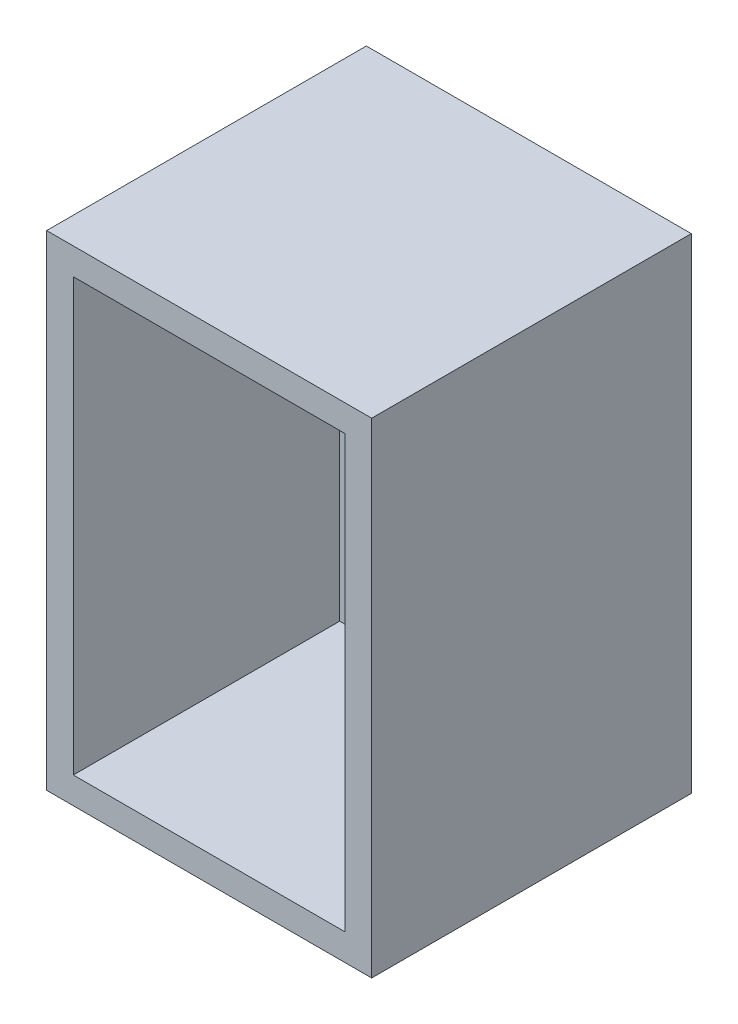
ISO-10303-21;
HEADER;
FILE_DESCRIPTION(('STEP AP214'),'2;1');
FILE_NAME('part.step','',(''),(''),'','','');
FILE_SCHEMA(('AUTOMOTIVE_DESIGN { 1 0 10303 214 1 1 1 1 }'));
ENDSEC;
DATA;
#1=APPLICATION_CONTEXT('core data for automotive mechanical design processes');
#2=APPLICATION_PROTOCOL_DEFINITION('international standard','automotive_design',2000,#1);
#3=PRODUCT_CONTEXT('',#1,'mechanical');
#4=PRODUCT('Part','Part','',(#3));
#5=PRODUCT_RELATED_PRODUCT_CATEGORY('part','',(#4));
#6=PRODUCT_DEFINITION_FORMATION('','',#4);
#7=PRODUCT_DEFINITION_CONTEXT('part definition',#1,'design');
#8=PRODUCT_DEFINITION('design','',#6,#7);
#9=PRODUCT_DEFINITION_SHAPE('','',#8);
#10=(LENGTH_UNIT() NAMED_UNIT(*) SI_UNIT(.MILLI.,.METRE.));
#11=(NAMED_UNIT(*) PLANE_ANGLE_UNIT() SI_UNIT($,.RADIAN.));
#12=(NAMED_UNIT(*) SI_UNIT($,.STERADIAN.) SOLID_ANGLE_UNIT());
#13=UNCERTAINTY_MEASURE_WITH_UNIT(LENGTH_MEASURE(1.E-05),#10,'distance_accuracy_value','');
#14=(GEOMETRIC_REPRESENTATION_CONTEXT(3) GLOBAL_UNCERTAINTY_ASSIGNED_CONTEXT((#13)) GLOBAL_UNIT_ASSIGNED_CONTEXT((#10,
#11,#12)) REPRESENTATION_CONTEXT('',''));
#15=CARTESIAN_POINT('',(0.,0.,0.));
#16=DIRECTION('',(0.,0.,1.));
#17=DIRECTION('',(1.,0.,0.));
#18=AXIS2_PLACEMENT_3D('',#15,#16,#17);
#19=CARTESIAN_POINT('',(0.,0.,50.));
#20=DIRECTION('',(0.,0.,1.));
#21=DIRECTION('',(1.,0.,0.));
#22=AXIS2_PLACEMENT_3D('',#19,#20,#21);
#23=PLANE('',#22);
#24=DIRECTION('',(0.,1.,0.));
#25=VECTOR('',#24,1.);
#26=CARTESIAN_POINT('',(30.5,-45.5,50.));
#27=LINE('',#26,#25);
#28=CARTESIAN_POINT('',(30.5,-45.5,50.));
#29=VERTEX_POINT('',#28);
#30=CARTESIAN_POINT('',(30.5,45.5,50.));
#31=VERTEX_POINT('',#30);
#32=EDGE_CURVE('E103',#29,#31,#27,.T.);
#33=ORIENTED_EDGE('',*,*,#32,.T.);
#34=DIRECTION('',(-1.,0.,0.));
#35=VECTOR('',#34,1.);
#36=CARTESIAN_POINT('',(30.5,45.5,50.));
#37=LINE('',#36,#35);
#38=CARTESIAN_POINT('',(-30.5,45.5,50.));
#39=VERTEX_POINT('',#38);
#40=EDGE_CURVE('E158',#31,#39,#37,.T.);
#41=ORIENTED_EDGE('',*,*,#40,.T.);
#42=DIRECTION('',(0.,-1.,0.));
#43=VECTOR('',#42,1.);
#44=CARTESIAN_POINT('',(-30.5,-45.5,50.));
#45=LINE('',#44,#43);
#46=CARTESIAN_POINT('',(-30.5,-45.5,50.));
#47=VERTEX_POINT('',#46);
#48=EDGE_CURVE('E160',#39,#47,#45,.T.);
#49=ORIENTED_EDGE('',*,*,#48,.T.);
#50=DIRECTION('',(1.,0.,0.));
#51=VECTOR('',#50,1.);
#52=CARTESIAN_POINT('',(30.5,-45.5,50.));
#53=LINE('',#52,#51);
#54=EDGE_CURVE('E56',#47,#29,#53,.T.);
#55=ORIENTED_EDGE('',*,*,#54,.T.);
#56=EDGE_LOOP('',(#33,#41,#49,#55));
#57=FACE_BOUND('',#56,.T.);
#58=DIRECTION('',(1.,0.,0.));
#59=VECTOR('',#58,1.);
#60=CARTESIAN_POINT('',(25.5,-40.5,50.));
#61=LINE('',#60,#59);
#62=CARTESIAN_POINT('',(-25.5,-40.5,50.));
#63=VERTEX_POINT('',#62);
#64=CARTESIAN_POINT('',(25.5,-40.5,50.));
#65=VERTEX_POINT('',#64);
#66=EDGE_CURVE('E132',#63,#65,#61,.T.);
#67=ORIENTED_EDGE('',*,*,#66,.F.);
#68=DIRECTION('',(0.,-1.,0.));
#69=VECTOR('',#68,1.);
#70=CARTESIAN_POINT('',(-25.5,-40.5,50.));
#71=LINE('',#70,#69);
#72=CARTESIAN_POINT('',(-25.5,40.5,50.));
#73=VERTEX_POINT('',#72);
#74=EDGE_CURVE('E130',#73,#63,#71,.T.);
#75=ORIENTED_EDGE('',*,*,#74,.F.);
#76=DIRECTION('',(-1.,0.,0.));
#77=VECTOR('',#76,1.);
#78=CARTESIAN_POINT('',(25.5,40.5,50.));
#79=LINE('',#78,#77);
#80=CARTESIAN_POINT('',(25.5,40.5,50.));
#81=VERTEX_POINT('',#80);
#82=EDGE_CURVE('E137',#81,#73,#79,.T.);
#83=ORIENTED_EDGE('',*,*,#82,.F.);
#84=DIRECTION('',(0.,1.,0.));
#85=VECTOR('',#84,1.);
#86=CARTESIAN_POINT('',(25.5,-40.5,50.));
#87=LINE('',#86,#85);
#88=EDGE_CURVE('E135',#65,#81,#87,.T.);
#89=ORIENTED_EDGE('',*,*,#88,.F.);
#90=EDGE_LOOP('',(#67,#75,#83,#89));
#91=FACE_BOUND('',#90,.T.);
#92=ADVANCED_FACE('F33',(#57,#91),#23,.T.);
#93=CARTESIAN_POINT('',(30.5,-45.5,50.));
#94=DIRECTION('',(-1.,0.,0.));
#95=DIRECTION('',(0.,0.,1.));
#96=AXIS2_PLACEMENT_3D('',#93,#94,#95);
#97=PLANE('',#96);
#98=DIRECTION('',(0.,0.,-1.));
#99=VECTOR('',#98,1.);
#100=CARTESIAN_POINT('',(30.5,-45.5,50.));
#101=LINE('',#100,#99);
#102=CARTESIAN_POINT('',(30.5,-45.5,-10.));
#103=VERTEX_POINT('',#102);
#104=EDGE_CURVE('E98',#29,#103,#101,.T.);
#105=ORIENTED_EDGE('',*,*,#104,.T.);
#106=DIRECTION('',(0.,-1.,0.));
#107=VECTOR('',#106,1.);
#108=CARTESIAN_POINT('',(30.5,-45.5,-10.));
#109=LINE('',#108,#107);
#110=CARTESIAN_POINT('',(30.5,45.5,-10.));
#111=VERTEX_POINT('',#110);
#112=EDGE_CURVE('E102',#111,#103,#109,.T.);
#113=ORIENTED_EDGE('',*,*,#112,.F.);
#114=DIRECTION('',(0.,0.,-1.));
#115=VECTOR('',#114,1.);
#116=CARTESIAN_POINT('',(30.5,45.5,50.));
#117=LINE('',#116,#115);
#118=EDGE_CURVE('E11',#31,#111,#117,.T.);
#119=ORIENTED_EDGE('',*,*,#118,.F.);
#120=ORIENTED_EDGE('',*,*,#32,.F.);
#121=EDGE_LOOP('',(#105,#113,#119,#120));
#122=FACE_BOUND('',#121,.T.);
#123=ADVANCED_FACE('F35',(#122),#97,.F.);
#124=CARTESIAN_POINT('',(30.5,45.5,50.));
#125=DIRECTION('',(0.,-1.,0.));
#126=DIRECTION('',(1.,0.,0.));
#127=AXIS2_PLACEMENT_3D('',#124,#125,#126);
#128=PLANE('',#127);
#129=ORIENTED_EDGE('',*,*,#118,.T.);
#130=DIRECTION('',(1.,0.,0.));
#131=VECTOR('',#130,1.);
#132=CARTESIAN_POINT('',(-30.5,45.5,-10.));
#133=LINE('',#132,#131);
#134=CARTESIAN_POINT('',(-30.5,45.5,-10.));
#135=VERTEX_POINT('',#134);
#136=EDGE_CURVE('E119',#135,#111,#133,.T.);
#137=ORIENTED_EDGE('',*,*,#136,.F.);
#138=DIRECTION('',(0.,0.,-1.));
#139=VECTOR('',#138,1.);
#140=CARTESIAN_POINT('',(-30.5,45.5,50.));
#141=LINE('',#140,#139);
#142=EDGE_CURVE('E41',#39,#135,#141,.T.);
#143=ORIENTED_EDGE('',*,*,#142,.F.);
#144=ORIENTED_EDGE('',*,*,#40,.F.);
#145=EDGE_LOOP('',(#129,#137,#143,#144));
#146=FACE_BOUND('',#145,.T.);
#147=ADVANCED_FACE('F168',(#146),#128,.F.);
#148=CARTESIAN_POINT('',(-30.5,-45.5,50.));
#149=DIRECTION('',(1.,0.,0.));
#150=DIRECTION('',(0.,1.,0.));
#151=AXIS2_PLACEMENT_3D('',#148,#149,#150);
#152=PLANE('',#151);
#153=ORIENTED_EDGE('',*,*,#142,.T.);
#154=DIRECTION('',(0.,1.,0.));
#155=VECTOR('',#154,1.);
#156=CARTESIAN_POINT('',(-30.5,-45.5,-10.));
#157=LINE('',#156,#155);
#158=CARTESIAN_POINT('',(-30.5,-45.5,-10.));
#159=VERTEX_POINT('',#158);
#160=EDGE_CURVE('E114',#159,#135,#157,.T.);
#161=ORIENTED_EDGE('',*,*,#160,.F.);
#162=DIRECTION('',(0.,0.,-1.));
#163=VECTOR('',#162,1.);
#164=CARTESIAN_POINT('',(-30.5,-45.5,50.));
#165=LINE('',#164,#163);
#166=EDGE_CURVE('E105',#47,#159,#165,.T.);
#167=ORIENTED_EDGE('',*,*,#166,.F.);
#168=ORIENTED_EDGE('',*,*,#48,.F.);
#169=EDGE_LOOP('',(#153,#161,#167,#168));
#170=FACE_BOUND('',#169,.T.);
#171=ADVANCED_FACE('F166',(#170),#152,.F.);
#172=CARTESIAN_POINT('',(30.5,-45.5,50.));
#173=DIRECTION('',(0.,1.,0.));
#174=DIRECTION('',(-1.,0.,0.));
#175=AXIS2_PLACEMENT_3D('',#172,#173,#174);
#176=PLANE('',#175);
#177=ORIENTED_EDGE('',*,*,#166,.T.);
#178=DIRECTION('',(-1.,0.,0.));
#179=VECTOR('',#178,1.);
#180=CARTESIAN_POINT('',(-30.5,-45.5,-10.));
#181=LINE('',#180,#179);
#182=EDGE_CURVE('E108',#103,#159,#181,.T.);
#183=ORIENTED_EDGE('',*,*,#182,.F.);
#184=ORIENTED_EDGE('',*,*,#104,.F.);
#185=ORIENTED_EDGE('',*,*,#54,.F.);
#186=EDGE_LOOP('',(#177,#183,#184,#185));
#187=FACE_BOUND('',#186,.T.);
#188=ADVANCED_FACE('F109',(#187),#176,.F.);
#189=CARTESIAN_POINT('',(-25.5,-40.5,50.));
#190=DIRECTION('',(1.,0.,0.));
#191=DIRECTION('',(0.,0.,-1.));
#192=AXIS2_PLACEMENT_3D('',#189,#190,#191);
#193=PLANE('',#192);
#194=DIRECTION('',(0.,-1.,0.));
#195=VECTOR('',#194,1.);
#196=CARTESIAN_POINT('',(-25.5,-40.5,0.));
#197=LINE('',#196,#195);
#198=CARTESIAN_POINT('',(-25.5,40.5,0.));
#199=VERTEX_POINT('',#198);
#200=CARTESIAN_POINT('',(-25.5,-40.5,0.));
#201=VERTEX_POINT('',#200);
#202=EDGE_CURVE('E129',#199,#201,#197,.T.);
#203=ORIENTED_EDGE('',*,*,#202,.F.);
#204=DIRECTION('',(0.,0.,-1.));
#205=VECTOR('',#204,1.);
#206=CARTESIAN_POINT('',(-25.5,40.5,50.));
#207=LINE('',#206,#205);
#208=EDGE_CURVE('E139',#73,#199,#207,.T.);
#209=ORIENTED_EDGE('',*,*,#208,.F.);
#210=ORIENTED_EDGE('',*,*,#74,.T.);
#211=DIRECTION('',(0.,0.,-1.));
#212=VECTOR('',#211,1.);
#213=CARTESIAN_POINT('',(-25.5,-40.5,50.));
#214=LINE('',#213,#212);
#215=EDGE_CURVE('E154',#63,#201,#214,.T.);
#216=ORIENTED_EDGE('',*,*,#215,.T.);
#217=EDGE_LOOP('',(#203,#209,#210,#216));
#218=FACE_BOUND('',#217,.T.);
#219=ADVANCED_FACE('F187',(#218),#193,.T.);
#220=CARTESIAN_POINT('',(25.5,-40.5,50.));
#221=DIRECTION('',(0.,1.,0.));
#222=DIRECTION('',(-1.,0.,0.));
#223=AXIS2_PLACEMENT_3D('',#220,#221,#222);
#224=PLANE('',#223);
#225=DIRECTION('',(1.,0.,0.));
#226=VECTOR('',#225,1.);
#227=CARTESIAN_POINT('',(25.5,-40.5,0.));
#228=LINE('',#227,#226);
#229=CARTESIAN_POINT('',(25.5,-40.5,0.));
#230=VERTEX_POINT('',#229);
#231=EDGE_CURVE('E142',#201,#230,#228,.T.);
#232=ORIENTED_EDGE('',*,*,#231,.F.);
#233=ORIENTED_EDGE('',*,*,#215,.F.);
#234=ORIENTED_EDGE('',*,*,#66,.T.);
#235=DIRECTION('',(0.,0.,-1.));
#236=VECTOR('',#235,1.);
#237=CARTESIAN_POINT('',(25.5,-40.5,50.));
#238=LINE('',#237,#236);
#239=EDGE_CURVE('E152',#65,#230,#238,.T.);
#240=ORIENTED_EDGE('',*,*,#239,.T.);
#241=EDGE_LOOP('',(#232,#233,#234,#240));
#242=FACE_BOUND('',#241,.T.);
#243=ADVANCED_FACE('F179',(#242),#224,.T.);
#244=CARTESIAN_POINT('',(25.5,-40.5,50.));
#245=DIRECTION('',(-1.,0.,0.));
#246=DIRECTION('',(0.,0.,1.));
#247=AXIS2_PLACEMENT_3D('',#244,#245,#246);
#248=PLANE('',#247);
#249=DIRECTION('',(0.,1.,0.));
#250=VECTOR('',#249,1.);
#251=CARTESIAN_POINT('',(25.5,-40.5,0.));
#252=LINE('',#251,#250);
#253=CARTESIAN_POINT('',(25.5,40.5,0.));
#254=VERTEX_POINT('',#253);
#255=EDGE_CURVE('E145',#230,#254,#252,.T.);
#256=ORIENTED_EDGE('',*,*,#255,.F.);
#257=ORIENTED_EDGE('',*,*,#239,.F.);
#258=ORIENTED_EDGE('',*,*,#88,.T.);
#259=DIRECTION('',(0.,0.,-1.));
#260=VECTOR('',#259,1.);
#261=CARTESIAN_POINT('',(25.5,40.5,50.));
#262=LINE('',#261,#260);
#263=EDGE_CURVE('E48',#81,#254,#262,.T.);
#264=ORIENTED_EDGE('',*,*,#263,.T.);
#265=EDGE_LOOP('',(#256,#257,#258,#264));
#266=FACE_BOUND('',#265,.T.);
#267=ADVANCED_FACE('F182',(#266),#248,.T.);
#268=CARTESIAN_POINT('',(25.5,40.5,50.));
#269=DIRECTION('',(0.,-1.,0.));
#270=DIRECTION('',(0.,0.,-1.));
#271=AXIS2_PLACEMENT_3D('',#268,#269,#270);
#272=PLANE('',#271);
#273=DIRECTION('',(-1.,0.,0.));
#274=VECTOR('',#273,1.);
#275=CARTESIAN_POINT('',(25.5,40.5,0.));
#276=LINE('',#275,#274);
#277=EDGE_CURVE('E133',#254,#199,#276,.T.);
#278=ORIENTED_EDGE('',*,*,#277,.F.);
#279=ORIENTED_EDGE('',*,*,#263,.F.);
#280=ORIENTED_EDGE('',*,*,#82,.T.);
#281=ORIENTED_EDGE('',*,*,#208,.T.);
#282=EDGE_LOOP('',(#278,#279,#280,#281));
#283=FACE_BOUND('',#282,.T.);
#284=ADVANCED_FACE('F189',(#283),#272,.T.);
#285=CARTESIAN_POINT('',(0.,0.,0.));
#286=DIRECTION('',(0.,0.,-1.));
#287=DIRECTION('',(-1.,0.,0.));
#288=AXIS2_PLACEMENT_3D('',#285,#286,#287);
#289=PLANE('',#288);
#290=CARTESIAN_POINT('',(0.,-25.,0.));
#291=DIRECTION('',(0.,0.,-1.));
#292=DIRECTION('',(-1.,0.,0.));
#293=AXIS2_PLACEMENT_3D('',#290,#291,#292);
#294=CIRCLE('',#293,5.);
#295=CARTESIAN_POINT('',(-5.,-25.,0.));
#296=VERTEX_POINT('',#295);
#297=EDGE_CURVE('E120',#296,#296,#294,.T.);
#298=ORIENTED_EDGE('',*,*,#297,.T.);
#299=EDGE_LOOP('',(#298));
#300=FACE_BOUND('',#299,.T.);
#301=ORIENTED_EDGE('',*,*,#277,.T.);
#302=ORIENTED_EDGE('',*,*,#202,.T.);
#303=ORIENTED_EDGE('',*,*,#231,.T.);
#304=ORIENTED_EDGE('',*,*,#255,.T.);
#305=EDGE_LOOP('',(#301,#302,#303,#304));
#306=FACE_BOUND('',#305,.T.);
#307=ADVANCED_FACE('F184',(#300,#306),#289,.F.);
#308=CARTESIAN_POINT('',(0.,0.,-10.));
#309=DIRECTION('',(0.,0.,-1.));
#310=DIRECTION('',(-1.,0.,0.));
#311=AXIS2_PLACEMENT_3D('',#308,#309,#310);
#312=PLANE('',#311);
#313=CARTESIAN_POINT('',(0.,-25.,-10.));
#314=DIRECTION('',(0.,0.,-1.));
#315=DIRECTION('',(-1.,0.,0.));
#316=AXIS2_PLACEMENT_3D('',#313,#314,#315);
#317=CIRCLE('',#316,5.);
#318=CARTESIAN_POINT('',(-5.,-25.,-10.));
#319=VERTEX_POINT('',#318);
#320=EDGE_CURVE('E123',#319,#319,#317,.T.);
#321=ORIENTED_EDGE('',*,*,#320,.F.);
#322=EDGE_LOOP('',(#321));
#323=FACE_BOUND('',#322,.T.);
#324=ORIENTED_EDGE('',*,*,#112,.T.);
#325=ORIENTED_EDGE('',*,*,#182,.T.);
#326=ORIENTED_EDGE('',*,*,#160,.T.);
#327=ORIENTED_EDGE('',*,*,#136,.T.);
#328=EDGE_LOOP('',(#324,#325,#326,#327));
#329=FACE_BOUND('',#328,.T.);
#330=ADVANCED_FACE('F117',(#323,#329),#312,.T.);
#331=CARTESIAN_POINT('',(0.,-25.,0.));
#332=DIRECTION('',(0.,0.,-1.));
#333=DIRECTION('',(-1.,0.,0.));
#334=AXIS2_PLACEMENT_3D('',#331,#332,#333);
#335=CYLINDRICAL_SURFACE('',#334,5.);
#336=ORIENTED_EDGE('',*,*,#297,.F.);
#337=EDGE_LOOP('',(#336));
#338=FACE_BOUND('',#337,.T.);
#339=ORIENTED_EDGE('',*,*,#320,.T.);
#340=EDGE_LOOP('',(#339));
#341=FACE_BOUND('',#340,.T.);
#342=ADVANCED_FACE('F277',(#338,#341),#335,.F.);
#343=CLOSED_SHELL('',(#92,#123,#147,#171,#188,#219,#243,#267,#284,#307,#330,#342));
#344=MANIFOLD_SOLID_BREP('B2',#343);
#345=ADVANCED_BREP_SHAPE_REPRESENTATION('',(#18,#344),#14);
#346=SHAPE_DEFINITION_REPRESENTATION(#9,#345);
ENDSEC;
END-ISO-10303-21;
